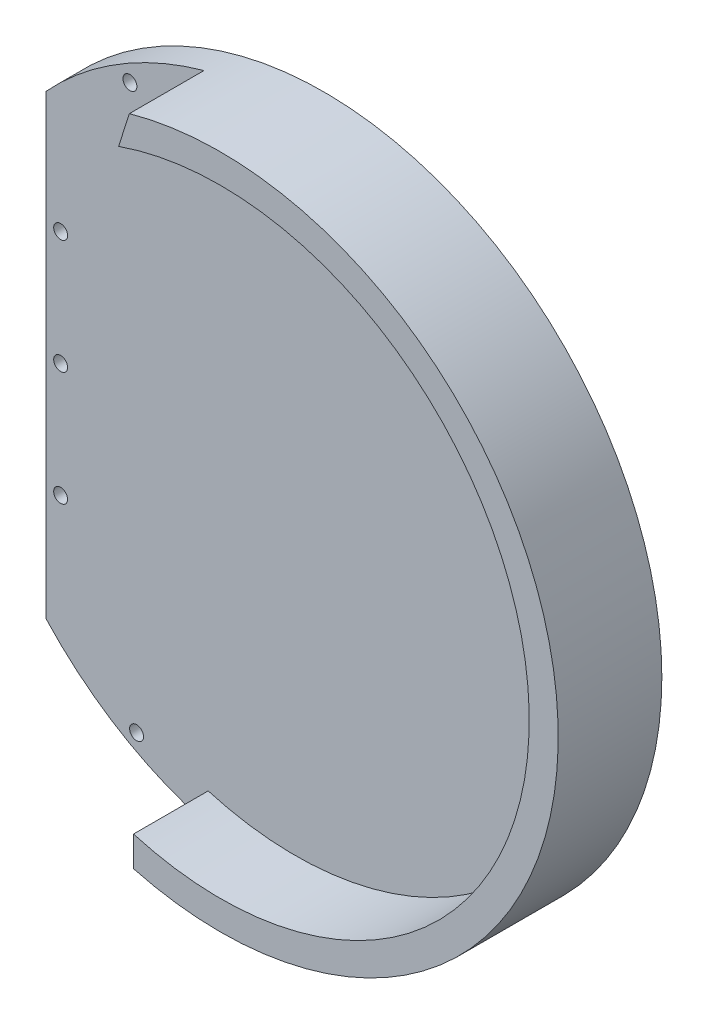
ISO-10303-21;
HEADER;
FILE_DESCRIPTION(('STEP AP214'),'2;1');
FILE_NAME('part.step','',(''),(''),'','','');
FILE_SCHEMA(('AUTOMOTIVE_DESIGN { 1 0 10303 214 1 1 1 1 }'));
ENDSEC;
DATA;
#1=APPLICATION_CONTEXT('core data for automotive mechanical design processes');
#2=APPLICATION_PROTOCOL_DEFINITION('international standard','automotive_design',2000,#1);
#3=PRODUCT_CONTEXT('',#1,'mechanical');
#4=PRODUCT('Part','Part','',(#3));
#5=PRODUCT_RELATED_PRODUCT_CATEGORY('part','',(#4));
#6=PRODUCT_DEFINITION_FORMATION('','',#4);
#7=PRODUCT_DEFINITION_CONTEXT('part definition',#1,'design');
#8=PRODUCT_DEFINITION('design','',#6,#7);
#9=PRODUCT_DEFINITION_SHAPE('','',#8);
#10=(LENGTH_UNIT() NAMED_UNIT(*) SI_UNIT(.MILLI.,.METRE.));
#11=(NAMED_UNIT(*) PLANE_ANGLE_UNIT() SI_UNIT($,.RADIAN.));
#12=(NAMED_UNIT(*) SI_UNIT($,.STERADIAN.) SOLID_ANGLE_UNIT());
#13=UNCERTAINTY_MEASURE_WITH_UNIT(LENGTH_MEASURE(1.E-05),#10,'distance_accuracy_value','');
#14=(GEOMETRIC_REPRESENTATION_CONTEXT(3) GLOBAL_UNCERTAINTY_ASSIGNED_CONTEXT((#13)) GLOBAL_UNIT_ASSIGNED_CONTEXT((#10,
#11,#12)) REPRESENTATION_CONTEXT('',''));
#15=CARTESIAN_POINT('',(0.,0.,0.));
#16=DIRECTION('',(0.,0.,1.));
#17=DIRECTION('',(1.,0.,0.));
#18=AXIS2_PLACEMENT_3D('',#15,#16,#17);
#19=CARTESIAN_POINT('',(42.9355150351706,0.,5.));
#20=DIRECTION('',(0.,0.,-1.));
#21=DIRECTION('',(-1.,0.,0.));
#22=AXIS2_PLACEMENT_3D('',#19,#20,#21);
#23=PLANE('',#22);
#24=CARTESIAN_POINT('',(2.5,19.70875,5.));
#25=DIRECTION('',(0.,0.,1.));
#26=DIRECTION('',(1.,0.,0.));
#27=AXIS2_PLACEMENT_3D('',#24,#25,#26);
#28=CIRCLE('',#27,1.2);
#29=CARTESIAN_POINT('',(3.7,19.70875,5.));
#30=VERTEX_POINT('',#29);
#31=EDGE_CURVE('E120',#30,#30,#28,.T.);
#32=ORIENTED_EDGE('',*,*,#31,.F.);
#33=EDGE_LOOP('',(#32));
#34=FACE_BOUND('',#33,.T.);
#35=CARTESIAN_POINT('',(2.5,0.,5.));
#36=DIRECTION('',(0.,0.,1.));
#37=DIRECTION('',(1.,0.,0.));
#38=AXIS2_PLACEMENT_3D('',#35,#36,#37);
#39=CIRCLE('',#38,1.2);
#40=CARTESIAN_POINT('',(3.7,0.,5.));
#41=VERTEX_POINT('',#40);
#42=EDGE_CURVE('E121',#41,#41,#39,.T.);
#43=ORIENTED_EDGE('',*,*,#42,.F.);
#44=EDGE_LOOP('',(#43));
#45=FACE_BOUND('',#44,.T.);
#46=CARTESIAN_POINT('',(2.5,-19.70875,5.));
#47=DIRECTION('',(0.,0.,1.));
#48=DIRECTION('',(1.,0.,0.));
#49=AXIS2_PLACEMENT_3D('',#46,#47,#48);
#50=CIRCLE('',#49,1.2);
#51=CARTESIAN_POINT('',(3.7,-19.70875,5.));
#52=VERTEX_POINT('',#51);
#53=EDGE_CURVE('E127',#52,#52,#50,.T.);
#54=ORIENTED_EDGE('',*,*,#53,.F.);
#55=EDGE_LOOP('',(#54));
#56=FACE_BOUND('',#55,.T.);
#57=CARTESIAN_POINT('',(15.6030670012185,-48.6104558619186,5.));
#58=DIRECTION('',(0.,0.,1.));
#59=DIRECTION('',(1.,0.,0.));
#60=AXIS2_PLACEMENT_3D('',#57,#58,#59);
#61=CIRCLE('',#60,1.2);
#62=CARTESIAN_POINT('',(16.8030670012185,-48.6104558619186,5.));
#63=VERTEX_POINT('',#62);
#64=EDGE_CURVE('E133',#63,#63,#61,.T.);
#65=ORIENTED_EDGE('',*,*,#64,.F.);
#66=EDGE_LOOP('',(#65));
#67=FACE_BOUND('',#66,.T.);
#68=CARTESIAN_POINT('',(14.4503829734086,47.941684776241,5.));
#69=DIRECTION('',(0.,0.,1.));
#70=DIRECTION('',(1.,0.,0.));
#71=AXIS2_PLACEMENT_3D('',#68,#69,#70);
#72=CIRCLE('',#71,1.20000000000001);
#73=CARTESIAN_POINT('',(15.6503829734086,47.941684776241,5.));
#74=VERTEX_POINT('',#73);
#75=EDGE_CURVE('E108',#74,#74,#72,.T.);
#76=ORIENTED_EDGE('',*,*,#75,.F.);
#77=EDGE_LOOP('',(#76));
#78=FACE_BOUND('',#77,.T.);
#79=DIRECTION('',(0.,-1.,0.));
#80=VECTOR('',#79,1.);
#81=CARTESIAN_POINT('',(27.955,-56.32745269286,5.));
#82=LINE('',#81,#80);
#83=CARTESIAN_POINT('',(27.955,-51.1363576843139,5.));
#84=VERTEX_POINT('',#83);
#85=CARTESIAN_POINT('',(27.955,-56.32745269286,5.));
#86=VERTEX_POINT('',#85);
#87=EDGE_CURVE('E48',#84,#86,#82,.T.);
#88=ORIENTED_EDGE('',*,*,#87,.F.);
#89=CARTESIAN_POINT('',(42.9355150351706,0.,5.));
#90=DIRECTION('',(0.,0.,-1.));
#91=DIRECTION('',(-1.,0.,0.));
#92=AXIS2_PLACEMENT_3D('',#89,#90,#91);
#93=CIRCLE('',#92,53.2854849648294);
#94=CARTESIAN_POINT('',(25.3781791753109,50.3098684697262,5.));
#95=VERTEX_POINT('',#94);
#96=EDGE_CURVE('E164',#95,#84,#93,.T.);
#97=ORIENTED_EDGE('',*,*,#96,.F.);
#98=DIRECTION('',(-0.304110924523191,-0.952636628303599,0.));
#99=VECTOR('',#98,1.);
#100=CARTESIAN_POINT('',(25.3781791753109,50.3098684697262,5.));
#101=LINE('',#100,#99);
#102=CARTESIAN_POINT('',(27.2366145278737,56.1314731718967,5.));
#103=VERTEX_POINT('',#102);
#104=EDGE_CURVE('E54',#103,#95,#101,.T.);
#105=ORIENTED_EDGE('',*,*,#104,.F.);
#106=CARTESIAN_POINT('',(42.9355150351706,0.,5.));
#107=DIRECTION('',(0.,0.,1.));
#108=DIRECTION('',(-1.,0.,0.));
#109=AXIS2_PLACEMENT_3D('',#106,#107,#108);
#110=CIRCLE('',#109,58.2854849648294);
#111=CARTESIAN_POINT('',(0.,39.4175,5.));
#112=VERTEX_POINT('',#111);
#113=EDGE_CURVE('E107',#103,#112,#110,.T.);
#114=ORIENTED_EDGE('',*,*,#113,.T.);
#115=DIRECTION('',(0.,-1.,0.));
#116=VECTOR('',#115,1.);
#117=CARTESIAN_POINT('',(0.,-39.4175,5.));
#118=LINE('',#117,#116);
#119=CARTESIAN_POINT('',(0.,-39.4175,5.));
#120=VERTEX_POINT('',#119);
#121=EDGE_CURVE('E146',#112,#120,#118,.T.);
#122=ORIENTED_EDGE('',*,*,#121,.T.);
#123=EDGE_CURVE('E144',#120,#86,#110,.T.);
#124=ORIENTED_EDGE('',*,*,#123,.T.);
#125=EDGE_LOOP('',(#88,#97,#105,#114,#122,#124));
#126=FACE_BOUND('',#125,.T.);
#127=ADVANCED_FACE('F33',(#34,#45,#56,#67,#78,#126),#23,.F.);
#128=CARTESIAN_POINT('',(42.9355150351706,0.,5.));
#129=DIRECTION('',(0.,0.,-1.));
#130=DIRECTION('',(-1.,0.,0.));
#131=AXIS2_PLACEMENT_3D('',#128,#129,#130);
#132=CYLINDRICAL_SURFACE('',#131,58.2854849648294);
#133=CARTESIAN_POINT('',(42.9355150351706,0.,0.));
#134=DIRECTION('',(0.,0.,1.));
#135=DIRECTION('',(-1.,0.,0.));
#136=AXIS2_PLACEMENT_3D('',#133,#134,#135);
#137=CIRCLE('',#136,58.2854849648294);
#138=CARTESIAN_POINT('',(0.,-39.4175,0.));
#139=VERTEX_POINT('',#138);
#140=CARTESIAN_POINT('',(0.,39.4175,0.));
#141=VERTEX_POINT('',#140);
#142=EDGE_CURVE('E141',#139,#141,#137,.T.);
#143=ORIENTED_EDGE('',*,*,#142,.T.);
#144=DIRECTION('',(0.,0.,-1.));
#145=VECTOR('',#144,1.);
#146=CARTESIAN_POINT('',(0.,39.4175,5.));
#147=LINE('',#146,#145);
#148=EDGE_CURVE('E11',#112,#141,#147,.T.);
#149=ORIENTED_EDGE('',*,*,#148,.F.);
#150=ORIENTED_EDGE('',*,*,#113,.F.);
#151=DIRECTION('',(0.,0.,-1.));
#152=VECTOR('',#151,1.);
#153=CARTESIAN_POINT('',(27.2366145278737,56.1314731718966,17.879));
#154=LINE('',#153,#152);
#155=CARTESIAN_POINT('',(27.2366145278737,56.1314731718966,17.879));
#156=VERTEX_POINT('',#155);
#157=EDGE_CURVE('E89',#156,#103,#154,.T.);
#158=ORIENTED_EDGE('',*,*,#157,.F.);
#159=CARTESIAN_POINT('',(42.9355150351706,0.,17.879));
#160=DIRECTION('',(0.,0.,1.));
#161=DIRECTION('',(1.,0.,0.));
#162=AXIS2_PLACEMENT_3D('',#159,#160,#161);
#163=CIRCLE('',#162,58.2854849648294);
#164=CARTESIAN_POINT('',(27.955,-56.32745269286,17.879));
#165=VERTEX_POINT('',#164);
#166=EDGE_CURVE('E95',#165,#156,#163,.T.);
#167=ORIENTED_EDGE('',*,*,#166,.F.);
#168=DIRECTION('',(0.,0.,-1.));
#169=VECTOR('',#168,1.);
#170=CARTESIAN_POINT('',(27.955,-56.32745269286,17.879));
#171=LINE('',#170,#169);
#172=EDGE_CURVE('E162',#165,#86,#171,.T.);
#173=ORIENTED_EDGE('',*,*,#172,.T.);
#174=ORIENTED_EDGE('',*,*,#123,.F.);
#175=DIRECTION('',(0.,0.,-1.));
#176=VECTOR('',#175,1.);
#177=CARTESIAN_POINT('',(0.,-39.4175,5.));
#178=LINE('',#177,#176);
#179=EDGE_CURVE('E41',#120,#139,#178,.T.);
#180=ORIENTED_EDGE('',*,*,#179,.T.);
#181=EDGE_LOOP('',(#143,#149,#150,#158,#167,#173,#174,#180));
#182=FACE_BOUND('',#181,.T.);
#183=ADVANCED_FACE('F35',(#182),#132,.T.);
#184=CARTESIAN_POINT('',(0.,-39.4175,5.));
#185=DIRECTION('',(1.,0.,0.));
#186=DIRECTION('',(0.,1.,0.));
#187=AXIS2_PLACEMENT_3D('',#184,#185,#186);
#188=PLANE('',#187);
#189=DIRECTION('',(0.,-1.,0.));
#190=VECTOR('',#189,1.);
#191=CARTESIAN_POINT('',(0.,-39.4175,0.));
#192=LINE('',#191,#190);
#193=EDGE_CURVE('E149',#141,#139,#192,.T.);
#194=ORIENTED_EDGE('',*,*,#193,.T.);
#195=ORIENTED_EDGE('',*,*,#179,.F.);
#196=ORIENTED_EDGE('',*,*,#121,.F.);
#197=ORIENTED_EDGE('',*,*,#148,.T.);
#198=EDGE_LOOP('',(#194,#195,#196,#197));
#199=FACE_BOUND('',#198,.T.);
#200=ADVANCED_FACE('F158',(#199),#188,.F.);
#201=CARTESIAN_POINT('',(42.9355150351706,0.,0.));
#202=DIRECTION('',(0.,0.,-1.));
#203=DIRECTION('',(-1.,0.,0.));
#204=AXIS2_PLACEMENT_3D('',#201,#202,#203);
#205=PLANE('',#204);
#206=CARTESIAN_POINT('',(14.4503829734086,47.941684776241,0.));
#207=DIRECTION('',(0.,0.,1.));
#208=DIRECTION('',(1.,0.,0.));
#209=AXIS2_PLACEMENT_3D('',#206,#207,#208);
#210=CIRCLE('',#209,1.20000000000001);
#211=CARTESIAN_POINT('',(15.6503829734086,47.941684776241,0.));
#212=VERTEX_POINT('',#211);
#213=EDGE_CURVE('E111',#212,#212,#210,.T.);
#214=ORIENTED_EDGE('',*,*,#213,.T.);
#215=EDGE_LOOP('',(#214));
#216=FACE_BOUND('',#215,.T.);
#217=CARTESIAN_POINT('',(15.6030670012185,-48.6104558619186,0.));
#218=DIRECTION('',(0.,0.,1.));
#219=DIRECTION('',(1.,0.,0.));
#220=AXIS2_PLACEMENT_3D('',#217,#218,#219);
#221=CIRCLE('',#220,1.2);
#222=CARTESIAN_POINT('',(16.8030670012185,-48.6104558619186,0.));
#223=VERTEX_POINT('',#222);
#224=EDGE_CURVE('E130',#223,#223,#221,.T.);
#225=ORIENTED_EDGE('',*,*,#224,.T.);
#226=EDGE_LOOP('',(#225));
#227=FACE_BOUND('',#226,.T.);
#228=CARTESIAN_POINT('',(2.5,-19.70875,0.));
#229=DIRECTION('',(0.,0.,1.));
#230=DIRECTION('',(1.,0.,0.));
#231=AXIS2_PLACEMENT_3D('',#228,#229,#230);
#232=CIRCLE('',#231,1.2);
#233=CARTESIAN_POINT('',(3.7,-19.70875,0.));
#234=VERTEX_POINT('',#233);
#235=EDGE_CURVE('E124',#234,#234,#232,.T.);
#236=ORIENTED_EDGE('',*,*,#235,.T.);
#237=EDGE_LOOP('',(#236));
#238=FACE_BOUND('',#237,.T.);
#239=CARTESIAN_POINT('',(2.5,0.,0.));
#240=DIRECTION('',(0.,0.,1.));
#241=DIRECTION('',(1.,0.,0.));
#242=AXIS2_PLACEMENT_3D('',#239,#240,#241);
#243=CIRCLE('',#242,1.2);
#244=CARTESIAN_POINT('',(3.7,0.,0.));
#245=VERTEX_POINT('',#244);
#246=EDGE_CURVE('E117',#245,#245,#243,.T.);
#247=ORIENTED_EDGE('',*,*,#246,.T.);
#248=EDGE_LOOP('',(#247));
#249=FACE_BOUND('',#248,.T.);
#250=CARTESIAN_POINT('',(2.5,19.70875,0.));
#251=DIRECTION('',(0.,0.,1.));
#252=DIRECTION('',(1.,0.,0.));
#253=AXIS2_PLACEMENT_3D('',#250,#251,#252);
#254=CIRCLE('',#253,1.2);
#255=CARTESIAN_POINT('',(3.7,19.70875,0.));
#256=VERTEX_POINT('',#255);
#257=EDGE_CURVE('E138',#256,#256,#254,.T.);
#258=ORIENTED_EDGE('',*,*,#257,.T.);
#259=EDGE_LOOP('',(#258));
#260=FACE_BOUND('',#259,.T.);
#261=ORIENTED_EDGE('',*,*,#142,.F.);
#262=ORIENTED_EDGE('',*,*,#193,.F.);
#263=EDGE_LOOP('',(#261,#262));
#264=FACE_BOUND('',#263,.T.);
#265=ADVANCED_FACE('F157',(#216,#227,#238,#249,#260,#264),#205,.T.);
#266=CARTESIAN_POINT('',(2.5,19.70875,0.));
#267=DIRECTION('',(0.,0.,1.));
#268=DIRECTION('',(1.,0.,0.));
#269=AXIS2_PLACEMENT_3D('',#266,#267,#268);
#270=CYLINDRICAL_SURFACE('',#269,1.2);
#271=ORIENTED_EDGE('',*,*,#257,.F.);
#272=EDGE_LOOP('',(#271));
#273=FACE_BOUND('',#272,.T.);
#274=ORIENTED_EDGE('',*,*,#31,.T.);
#275=EDGE_LOOP('',(#274));
#276=FACE_BOUND('',#275,.T.);
#277=ADVANCED_FACE('F192',(#273,#276),#270,.F.);
#278=CARTESIAN_POINT('',(2.5,0.,0.));
#279=DIRECTION('',(0.,0.,1.));
#280=DIRECTION('',(1.,0.,0.));
#281=AXIS2_PLACEMENT_3D('',#278,#279,#280);
#282=CYLINDRICAL_SURFACE('',#281,1.2);
#283=ORIENTED_EDGE('',*,*,#246,.F.);
#284=EDGE_LOOP('',(#283));
#285=FACE_BOUND('',#284,.T.);
#286=ORIENTED_EDGE('',*,*,#42,.T.);
#287=EDGE_LOOP('',(#286));
#288=FACE_BOUND('',#287,.T.);
#289=ADVANCED_FACE('F211',(#285,#288),#282,.F.);
#290=CARTESIAN_POINT('',(2.5,-19.70875,0.));
#291=DIRECTION('',(0.,0.,1.));
#292=DIRECTION('',(1.,0.,0.));
#293=AXIS2_PLACEMENT_3D('',#290,#291,#292);
#294=CYLINDRICAL_SURFACE('',#293,1.2);
#295=ORIENTED_EDGE('',*,*,#235,.F.);
#296=EDGE_LOOP('',(#295));
#297=FACE_BOUND('',#296,.T.);
#298=ORIENTED_EDGE('',*,*,#53,.T.);
#299=EDGE_LOOP('',(#298));
#300=FACE_BOUND('',#299,.T.);
#301=ADVANCED_FACE('F218',(#297,#300),#294,.F.);
#302=CARTESIAN_POINT('',(15.6030670012185,-48.6104558619186,0.));
#303=DIRECTION('',(0.,0.,1.));
#304=DIRECTION('',(1.,0.,0.));
#305=AXIS2_PLACEMENT_3D('',#302,#303,#304);
#306=CYLINDRICAL_SURFACE('',#305,1.2);
#307=ORIENTED_EDGE('',*,*,#224,.F.);
#308=EDGE_LOOP('',(#307));
#309=FACE_BOUND('',#308,.T.);
#310=ORIENTED_EDGE('',*,*,#64,.T.);
#311=EDGE_LOOP('',(#310));
#312=FACE_BOUND('',#311,.T.);
#313=ADVANCED_FACE('F226',(#309,#312),#306,.F.);
#314=CARTESIAN_POINT('',(14.4503829734086,47.941684776241,0.));
#315=DIRECTION('',(0.,0.,1.));
#316=DIRECTION('',(1.,0.,0.));
#317=AXIS2_PLACEMENT_3D('',#314,#315,#316);
#318=CYLINDRICAL_SURFACE('',#317,1.20000000000001);
#319=ORIENTED_EDGE('',*,*,#213,.F.);
#320=EDGE_LOOP('',(#319));
#321=FACE_BOUND('',#320,.T.);
#322=ORIENTED_EDGE('',*,*,#75,.T.);
#323=EDGE_LOOP('',(#322));
#324=FACE_BOUND('',#323,.T.);
#325=ADVANCED_FACE('F180',(#321,#324),#318,.F.);
#326=CARTESIAN_POINT('',(25.3781791753109,50.3098684697262,17.879));
#327=DIRECTION('',(0.952636628303599,-0.304110924523191,0.));
#328=DIRECTION('',(0.304110924523192,0.952636628303599,0.));
#329=AXIS2_PLACEMENT_3D('',#326,#327,#328);
#330=PLANE('',#329);
#331=ORIENTED_EDGE('',*,*,#104,.T.);
#332=DIRECTION('',(0.,0.,-1.));
#333=VECTOR('',#332,1.);
#334=CARTESIAN_POINT('',(25.3781791753109,50.3098684697262,17.879));
#335=LINE('',#334,#333);
#336=CARTESIAN_POINT('',(25.3781791753109,50.3098684697262,17.879));
#337=VERTEX_POINT('',#336);
#338=EDGE_CURVE('E91',#337,#95,#335,.T.);
#339=ORIENTED_EDGE('',*,*,#338,.F.);
#340=DIRECTION('',(-0.304110924523191,-0.952636628303599,0.));
#341=VECTOR('',#340,1.);
#342=CARTESIAN_POINT('',(25.3781791753109,50.3098684697262,17.879));
#343=LINE('',#342,#341);
#344=EDGE_CURVE('E85',#156,#337,#343,.T.);
#345=ORIENTED_EDGE('',*,*,#344,.F.);
#346=ORIENTED_EDGE('',*,*,#157,.T.);
#347=EDGE_LOOP('',(#331,#339,#345,#346));
#348=FACE_BOUND('',#347,.T.);
#349=ADVANCED_FACE('F87',(#348),#330,.F.);
#350=CARTESIAN_POINT('',(42.9355150351706,0.,17.879));
#351=DIRECTION('',(0.,0.,-1.));
#352=DIRECTION('',(-1.,0.,0.));
#353=AXIS2_PLACEMENT_3D('',#350,#351,#352);
#354=CYLINDRICAL_SURFACE('',#353,53.2854849648294);
#355=ORIENTED_EDGE('',*,*,#96,.T.);
#356=DIRECTION('',(0.,0.,-1.));
#357=VECTOR('',#356,1.);
#358=CARTESIAN_POINT('',(27.955,-51.1363576843139,17.879));
#359=LINE('',#358,#357);
#360=CARTESIAN_POINT('',(27.955,-51.1363576843139,17.879));
#361=VERTEX_POINT('',#360);
#362=EDGE_CURVE('E113',#361,#84,#359,.T.);
#363=ORIENTED_EDGE('',*,*,#362,.F.);
#364=CARTESIAN_POINT('',(42.9355150351706,0.,17.879));
#365=DIRECTION('',(0.,0.,-1.));
#366=DIRECTION('',(-1.,0.,0.));
#367=AXIS2_PLACEMENT_3D('',#364,#365,#366);
#368=CIRCLE('',#367,53.2854849648294);
#369=EDGE_CURVE('E94',#337,#361,#368,.T.);
#370=ORIENTED_EDGE('',*,*,#369,.F.);
#371=ORIENTED_EDGE('',*,*,#338,.T.);
#372=EDGE_LOOP('',(#355,#363,#370,#371));
#373=FACE_BOUND('',#372,.T.);
#374=ADVANCED_FACE('F172',(#373),#354,.F.);
#375=CARTESIAN_POINT('',(27.955,-56.32745269286,17.879));
#376=DIRECTION('',(1.,0.,0.));
#377=DIRECTION('',(0.,0.,-1.));
#378=AXIS2_PLACEMENT_3D('',#375,#376,#377);
#379=PLANE('',#378);
#380=ORIENTED_EDGE('',*,*,#87,.T.);
#381=ORIENTED_EDGE('',*,*,#172,.F.);
#382=DIRECTION('',(0.,-1.,0.));
#383=VECTOR('',#382,1.);
#384=CARTESIAN_POINT('',(27.955,-56.32745269286,17.879));
#385=LINE('',#384,#383);
#386=EDGE_CURVE('E100',#361,#165,#385,.T.);
#387=ORIENTED_EDGE('',*,*,#386,.F.);
#388=ORIENTED_EDGE('',*,*,#362,.T.);
#389=EDGE_LOOP('',(#380,#381,#387,#388));
#390=FACE_BOUND('',#389,.T.);
#391=ADVANCED_FACE('F161',(#390),#379,.F.);
#392=CARTESIAN_POINT('',(42.9355150351706,0.,17.879));
#393=DIRECTION('',(0.,0.,1.));
#394=DIRECTION('',(1.,0.,0.));
#395=AXIS2_PLACEMENT_3D('',#392,#393,#394);
#396=PLANE('',#395);
#397=ORIENTED_EDGE('',*,*,#166,.T.);
#398=ORIENTED_EDGE('',*,*,#344,.T.);
#399=ORIENTED_EDGE('',*,*,#369,.T.);
#400=ORIENTED_EDGE('',*,*,#386,.T.);
#401=EDGE_LOOP('',(#397,#398,#399,#400));
#402=FACE_BOUND('',#401,.T.);
#403=ADVANCED_FACE('F98',(#402),#396,.T.);
#404=CLOSED_SHELL('',(#127,#183,#200,#265,#277,#289,#301,#313,#325,#349,#374,#391,#403));
#405=MANIFOLD_SOLID_BREP('B2',#404);
#406=ADVANCED_BREP_SHAPE_REPRESENTATION('',(#18,#405),#14);
#407=SHAPE_DEFINITION_REPRESENTATION(#9,#406);
ENDSEC;
END-ISO-10303-21;
